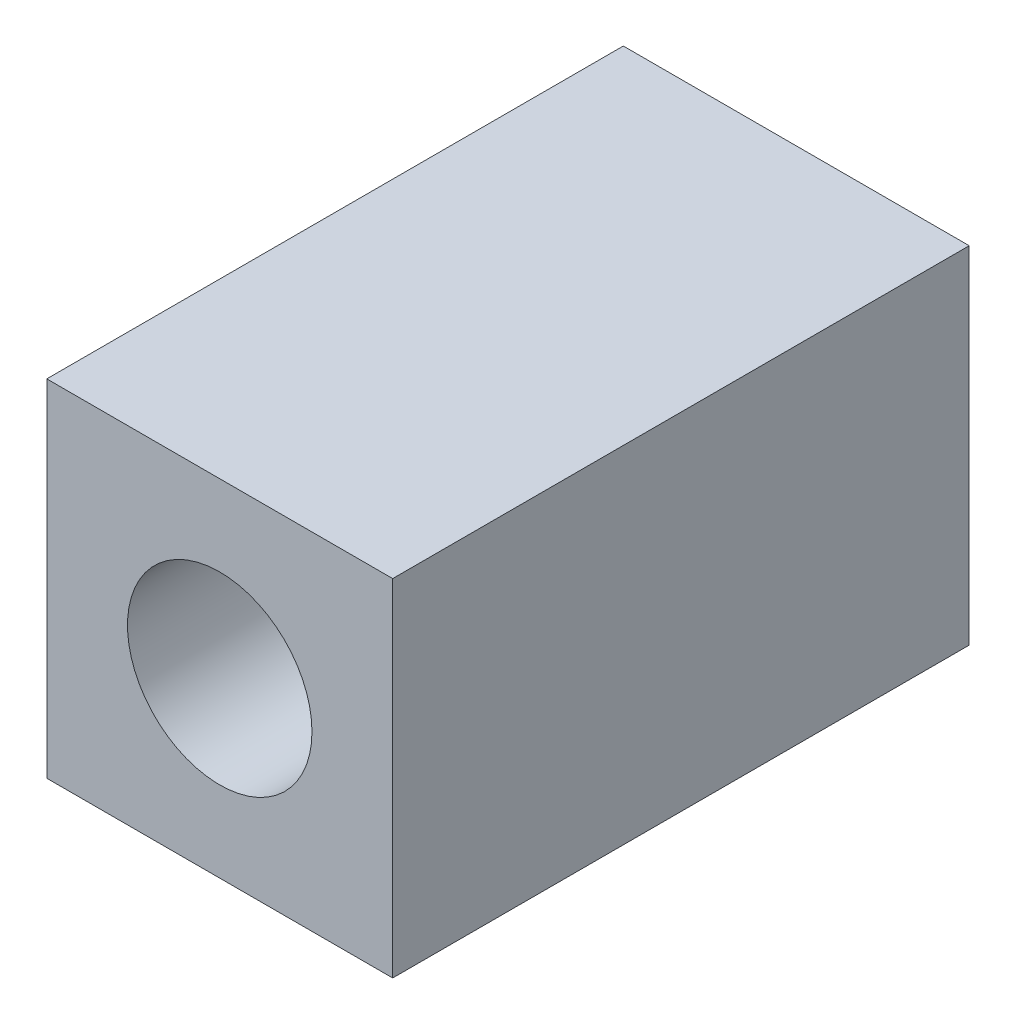
ISO-10303-21;
HEADER;
FILE_DESCRIPTION(('STEP AP214'),'2;1');
FILE_NAME('part.step','',(''),(''),'','','');
FILE_SCHEMA(('AUTOMOTIVE_DESIGN { 1 0 10303 214 1 1 1 1 }'));
ENDSEC;
DATA;
#1=APPLICATION_CONTEXT('core data for automotive mechanical design processes');
#2=APPLICATION_PROTOCOL_DEFINITION('international standard','automotive_design',2000,#1);
#3=PRODUCT_CONTEXT('',#1,'mechanical');
#4=PRODUCT('Part','Part','',(#3));
#5=PRODUCT_RELATED_PRODUCT_CATEGORY('part','',(#4));
#6=PRODUCT_DEFINITION_FORMATION('','',#4);
#7=PRODUCT_DEFINITION_CONTEXT('part definition',#1,'design');
#8=PRODUCT_DEFINITION('design','',#6,#7);
#9=PRODUCT_DEFINITION_SHAPE('','',#8);
#10=(LENGTH_UNIT() NAMED_UNIT(*) SI_UNIT(.MILLI.,.METRE.));
#11=(NAMED_UNIT(*) PLANE_ANGLE_UNIT() SI_UNIT($,.RADIAN.));
#12=(NAMED_UNIT(*) SI_UNIT($,.STERADIAN.) SOLID_ANGLE_UNIT());
#13=UNCERTAINTY_MEASURE_WITH_UNIT(LENGTH_MEASURE(1.E-05),#10,'distance_accuracy_value','');
#14=(GEOMETRIC_REPRESENTATION_CONTEXT(3) GLOBAL_UNCERTAINTY_ASSIGNED_CONTEXT((#13)) GLOBAL_UNIT_ASSIGNED_CONTEXT((#10,
#11,#12)) REPRESENTATION_CONTEXT('',''));
#15=CARTESIAN_POINT('',(0.,0.,0.));
#16=DIRECTION('',(0.,0.,1.));
#17=DIRECTION('',(1.,0.,0.));
#18=AXIS2_PLACEMENT_3D('',#15,#16,#17);
#19=CARTESIAN_POINT('',(-7.5,-7.5,25.));
#20=DIRECTION('',(-1.,0.,0.));
#21=DIRECTION('',(0.,0.,1.));
#22=AXIS2_PLACEMENT_3D('',#19,#20,#21);
#23=PLANE('',#22);
#24=DIRECTION('',(0.,1.,0.));
#25=VECTOR('',#24,1.);
#26=CARTESIAN_POINT('',(-7.5,-7.5,0.));
#27=LINE('',#26,#25);
#28=CARTESIAN_POINT('',(-7.5,-7.5,0.));
#29=VERTEX_POINT('',#28);
#30=CARTESIAN_POINT('',(-7.5,7.5,0.));
#31=VERTEX_POINT('',#30);
#32=EDGE_CURVE('E117',#29,#31,#27,.T.);
#33=ORIENTED_EDGE('',*,*,#32,.F.);
#34=DIRECTION('',(0.,0.,-1.));
#35=VECTOR('',#34,1.);
#36=CARTESIAN_POINT('',(-7.5,-7.5,25.));
#37=LINE('',#36,#35);
#38=CARTESIAN_POINT('',(-7.5,-7.5,25.));
#39=VERTEX_POINT('',#38);
#40=EDGE_CURVE('E11',#39,#29,#37,.T.);
#41=ORIENTED_EDGE('',*,*,#40,.F.);
#42=DIRECTION('',(0.,1.,0.));
#43=VECTOR('',#42,1.);
#44=CARTESIAN_POINT('',(-7.5,-7.5,25.));
#45=LINE('',#44,#43);
#46=CARTESIAN_POINT('',(-7.5,7.5,25.));
#47=VERTEX_POINT('',#46);
#48=EDGE_CURVE('E109',#39,#47,#45,.T.);
#49=ORIENTED_EDGE('',*,*,#48,.T.);
#50=DIRECTION('',(0.,0.,-1.));
#51=VECTOR('',#50,1.);
#52=CARTESIAN_POINT('',(-7.5,7.5,25.));
#53=LINE('',#52,#51);
#54=EDGE_CURVE('E48',#47,#31,#53,.T.);
#55=ORIENTED_EDGE('',*,*,#54,.T.);
#56=EDGE_LOOP('',(#33,#41,#49,#55));
#57=FACE_BOUND('',#56,.T.);
#58=ADVANCED_FACE('F45',(#57),#23,.T.);
#59=CARTESIAN_POINT('',(-7.5,-7.5,25.));
#60=DIRECTION('',(0.,1.,0.));
#61=DIRECTION('',(0.,0.,1.));
#62=AXIS2_PLACEMENT_3D('',#59,#60,#61);
#63=PLANE('',#62);
#64=DIRECTION('',(1.,0.,0.));
#65=VECTOR('',#64,1.);
#66=CARTESIAN_POINT('',(-7.5,-7.5,0.));
#67=LINE('',#66,#65);
#68=CARTESIAN_POINT('',(7.5,-7.5,0.));
#69=VERTEX_POINT('',#68);
#70=EDGE_CURVE('E79',#29,#69,#67,.T.);
#71=ORIENTED_EDGE('',*,*,#70,.T.);
#72=DIRECTION('',(0.,0.,-1.));
#73=VECTOR('',#72,1.);
#74=CARTESIAN_POINT('',(7.5,-7.5,25.));
#75=LINE('',#74,#73);
#76=CARTESIAN_POINT('',(7.5,-7.5,25.));
#77=VERTEX_POINT('',#76);
#78=EDGE_CURVE('E55',#77,#69,#75,.T.);
#79=ORIENTED_EDGE('',*,*,#78,.F.);
#80=DIRECTION('',(1.,0.,0.));
#81=VECTOR('',#80,1.);
#82=CARTESIAN_POINT('',(-7.5,-7.5,25.));
#83=LINE('',#82,#81);
#84=EDGE_CURVE('E96',#39,#77,#83,.T.);
#85=ORIENTED_EDGE('',*,*,#84,.F.);
#86=ORIENTED_EDGE('',*,*,#40,.T.);
#87=EDGE_LOOP('',(#71,#79,#85,#86));
#88=FACE_BOUND('',#87,.T.);
#89=ADVANCED_FACE('F134',(#88),#63,.F.);
#90=CARTESIAN_POINT('',(7.5,-7.5,25.));
#91=DIRECTION('',(-1.,0.,0.));
#92=DIRECTION('',(0.,0.,1.));
#93=AXIS2_PLACEMENT_3D('',#90,#91,#92);
#94=PLANE('',#93);
#95=DIRECTION('',(0.,1.,0.));
#96=VECTOR('',#95,1.);
#97=CARTESIAN_POINT('',(7.5,-7.5,0.));
#98=LINE('',#97,#96);
#99=CARTESIAN_POINT('',(7.5,7.5,0.));
#100=VERTEX_POINT('',#99);
#101=EDGE_CURVE('E104',#69,#100,#98,.T.);
#102=ORIENTED_EDGE('',*,*,#101,.T.);
#103=DIRECTION('',(0.,0.,-1.));
#104=VECTOR('',#103,1.);
#105=CARTESIAN_POINT('',(7.5,7.5,25.));
#106=LINE('',#105,#104);
#107=CARTESIAN_POINT('',(7.5,7.5,25.));
#108=VERTEX_POINT('',#107);
#109=EDGE_CURVE('E101',#108,#100,#106,.T.);
#110=ORIENTED_EDGE('',*,*,#109,.F.);
#111=DIRECTION('',(0.,1.,0.));
#112=VECTOR('',#111,1.);
#113=CARTESIAN_POINT('',(7.5,-7.5,25.));
#114=LINE('',#113,#112);
#115=EDGE_CURVE('E91',#77,#108,#114,.T.);
#116=ORIENTED_EDGE('',*,*,#115,.F.);
#117=ORIENTED_EDGE('',*,*,#78,.T.);
#118=EDGE_LOOP('',(#102,#110,#116,#117));
#119=FACE_BOUND('',#118,.T.);
#120=ADVANCED_FACE('F102',(#119),#94,.F.);
#121=CARTESIAN_POINT('',(-7.5,7.5,25.));
#122=DIRECTION('',(0.,1.,0.));
#123=DIRECTION('',(0.,0.,1.));
#124=AXIS2_PLACEMENT_3D('',#121,#122,#123);
#125=PLANE('',#124);
#126=DIRECTION('',(1.,0.,0.));
#127=VECTOR('',#126,1.);
#128=CARTESIAN_POINT('',(-7.5,7.5,0.));
#129=LINE('',#128,#127);
#130=EDGE_CURVE('E121',#31,#100,#129,.T.);
#131=ORIENTED_EDGE('',*,*,#130,.F.);
#132=ORIENTED_EDGE('',*,*,#54,.F.);
#133=DIRECTION('',(1.,0.,0.));
#134=VECTOR('',#133,1.);
#135=CARTESIAN_POINT('',(-7.5,7.5,25.));
#136=LINE('',#135,#134);
#137=EDGE_CURVE('E95',#47,#108,#136,.T.);
#138=ORIENTED_EDGE('',*,*,#137,.T.);
#139=ORIENTED_EDGE('',*,*,#109,.T.);
#140=EDGE_LOOP('',(#131,#132,#138,#139));
#141=FACE_BOUND('',#140,.T.);
#142=ADVANCED_FACE('F107',(#141),#125,.T.);
#143=CARTESIAN_POINT('',(0.,0.,25.));
#144=DIRECTION('',(0.,0.,-1.));
#145=DIRECTION('',(-1.,0.,0.));
#146=AXIS2_PLACEMENT_3D('',#143,#144,#145);
#147=PLANE('',#146);
#148=CARTESIAN_POINT('',(0.,0.,25.));
#149=DIRECTION('',(0.,0.,1.));
#150=DIRECTION('',(1.,0.,0.));
#151=AXIS2_PLACEMENT_3D('',#148,#149,#150);
#152=CIRCLE('',#151,4.);
#153=CARTESIAN_POINT('',(4.,0.,25.));
#154=VERTEX_POINT('',#153);
#155=EDGE_CURVE('E165',#154,#154,#152,.T.);
#156=ORIENTED_EDGE('',*,*,#155,.F.);
#157=EDGE_LOOP('',(#156));
#158=FACE_BOUND('',#157,.T.);
#159=ORIENTED_EDGE('',*,*,#48,.F.);
#160=ORIENTED_EDGE('',*,*,#84,.T.);
#161=ORIENTED_EDGE('',*,*,#115,.T.);
#162=ORIENTED_EDGE('',*,*,#137,.F.);
#163=EDGE_LOOP('',(#159,#160,#161,#162));
#164=FACE_BOUND('',#163,.T.);
#165=ADVANCED_FACE('F94',(#158,#164),#147,.F.);
#166=CARTESIAN_POINT('',(0.,0.,0.));
#167=DIRECTION('',(0.,0.,-1.));
#168=DIRECTION('',(-1.,0.,0.));
#169=AXIS2_PLACEMENT_3D('',#166,#167,#168);
#170=PLANE('',#169);
#171=CARTESIAN_POINT('',(0.,0.,0.));
#172=DIRECTION('',(0.,0.,1.));
#173=DIRECTION('',(1.,0.,0.));
#174=AXIS2_PLACEMENT_3D('',#171,#172,#173);
#175=CIRCLE('',#174,4.);
#176=CARTESIAN_POINT('',(4.,0.,0.));
#177=VERTEX_POINT('',#176);
#178=EDGE_CURVE('E122',#177,#177,#175,.T.);
#179=ORIENTED_EDGE('',*,*,#178,.T.);
#180=EDGE_LOOP('',(#179));
#181=FACE_BOUND('',#180,.T.);
#182=ORIENTED_EDGE('',*,*,#32,.T.);
#183=ORIENTED_EDGE('',*,*,#130,.T.);
#184=ORIENTED_EDGE('',*,*,#101,.F.);
#185=ORIENTED_EDGE('',*,*,#70,.F.);
#186=EDGE_LOOP('',(#182,#183,#184,#185));
#187=FACE_BOUND('',#186,.T.);
#188=ADVANCED_FACE('F131',(#181,#187),#170,.T.);
#189=CARTESIAN_POINT('',(0.,0.,0.));
#190=DIRECTION('',(0.,0.,1.));
#191=DIRECTION('',(1.,0.,0.));
#192=AXIS2_PLACEMENT_3D('',#189,#190,#191);
#193=CYLINDRICAL_SURFACE('',#192,4.);
#194=ORIENTED_EDGE('',*,*,#178,.F.);
#195=EDGE_LOOP('',(#194));
#196=FACE_BOUND('',#195,.T.);
#197=ORIENTED_EDGE('',*,*,#155,.T.);
#198=EDGE_LOOP('',(#197));
#199=FACE_BOUND('',#198,.T.);
#200=ADVANCED_FACE('F153',(#196,#199),#193,.F.);
#201=CLOSED_SHELL('',(#58,#89,#120,#142,#165,#188,#200));
#202=MANIFOLD_SOLID_BREP('B2',#201);
#203=ADVANCED_BREP_SHAPE_REPRESENTATION('',(#18,#202),#14);
#204=SHAPE_DEFINITION_REPRESENTATION(#9,#203);
ENDSEC;
END-ISO-10303-21;
